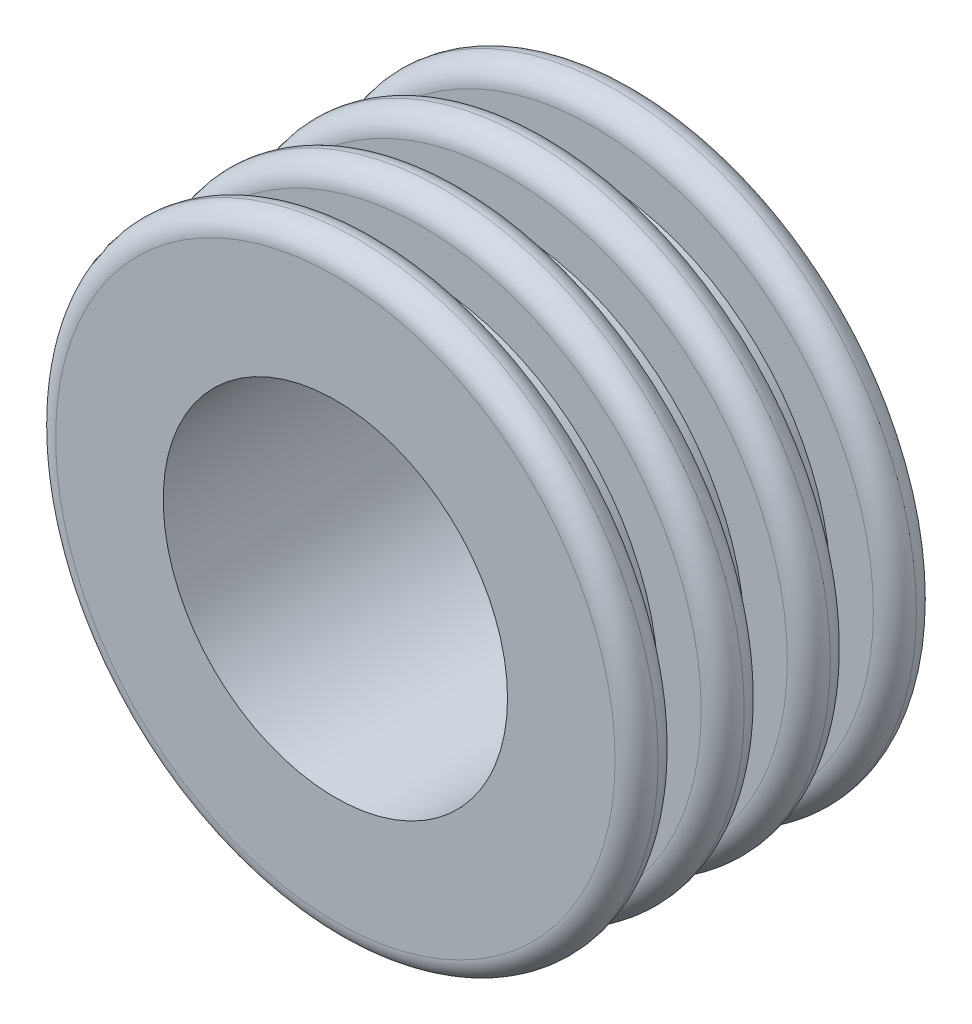
ISO-10303-21;
HEADER;
FILE_DESCRIPTION(('STEP AP214'),'2;1');
FILE_NAME('part.step','',(''),(''),'','','');
FILE_SCHEMA(('AUTOMOTIVE_DESIGN { 1 0 10303 214 1 1 1 1 }'));
ENDSEC;
DATA;
#1=APPLICATION_CONTEXT('core data for automotive mechanical design processes');
#2=APPLICATION_PROTOCOL_DEFINITION('international standard','automotive_design',2000,#1);
#3=PRODUCT_CONTEXT('',#1,'mechanical');
#4=PRODUCT('Part','Part','',(#3));
#5=PRODUCT_RELATED_PRODUCT_CATEGORY('part','',(#4));
#6=PRODUCT_DEFINITION_FORMATION('','',#4);
#7=PRODUCT_DEFINITION_CONTEXT('part definition',#1,'design');
#8=PRODUCT_DEFINITION('design','',#6,#7);
#9=PRODUCT_DEFINITION_SHAPE('','',#8);
#10=(LENGTH_UNIT() NAMED_UNIT(*) SI_UNIT(.MILLI.,.METRE.));
#11=(NAMED_UNIT(*) PLANE_ANGLE_UNIT() SI_UNIT($,.RADIAN.));
#12=(NAMED_UNIT(*) SI_UNIT($,.STERADIAN.) SOLID_ANGLE_UNIT());
#13=UNCERTAINTY_MEASURE_WITH_UNIT(LENGTH_MEASURE(1.E-05),#10,'distance_accuracy_value','');
#14=(GEOMETRIC_REPRESENTATION_CONTEXT(3) GLOBAL_UNCERTAINTY_ASSIGNED_CONTEXT((#13)) GLOBAL_UNIT_ASSIGNED_CONTEXT((#10,
#11,#12)) REPRESENTATION_CONTEXT('',''));
#15=CARTESIAN_POINT('',(0.,0.,0.));
#16=DIRECTION('',(0.,0.,1.));
#17=DIRECTION('',(1.,0.,0.));
#18=AXIS2_PLACEMENT_3D('',#15,#16,#17);
#19=CARTESIAN_POINT('',(0.,0.,-7.));
#20=DIRECTION('',(0.,0.,-1.));
#21=DIRECTION('',(1.,0.,0.));
#22=AXIS2_PLACEMENT_3D('',#19,#20,#21);
#23=PLANE('',#22);
#24=CARTESIAN_POINT('',(0.,0.,-7.));
#25=DIRECTION('',(0.,0.,1.));
#26=DIRECTION('',(1.,0.,0.));
#27=AXIS2_PLACEMENT_3D('',#24,#25,#26);
#28=CIRCLE('',#27,6.5);
#29=CARTESIAN_POINT('',(6.5,0.,-7.));
#30=VERTEX_POINT('',#29);
#31=EDGE_CURVE('E10',#30,#30,#28,.T.);
#32=ORIENTED_EDGE('',*,*,#31,.F.);
#33=EDGE_LOOP('',(#32));
#34=FACE_BOUND('',#33,.T.);
#35=CARTESIAN_POINT('',(0.,0.,-7.));
#36=DIRECTION('',(0.,0.,1.));
#37=DIRECTION('',(1.,0.,0.));
#38=AXIS2_PLACEMENT_3D('',#35,#36,#37);
#39=CIRCLE('',#38,4.);
#40=CARTESIAN_POINT('',(4.,0.,-7.));
#41=VERTEX_POINT('',#40);
#42=EDGE_CURVE('E88',#41,#41,#39,.T.);
#43=ORIENTED_EDGE('',*,*,#42,.T.);
#44=EDGE_LOOP('',(#43));
#45=FACE_BOUND('',#44,.T.);
#46=ADVANCED_FACE('F35',(#34,#45),#23,.T.);
#47=CARTESIAN_POINT('',(0.,0.,0.));
#48=DIRECTION('',(0.,0.,-1.));
#49=DIRECTION('',(1.,0.,0.));
#50=AXIS2_PLACEMENT_3D('',#47,#48,#49);
#51=PLANE('',#50);
#52=CARTESIAN_POINT('',(0.,0.,0.));
#53=DIRECTION('',(0.,0.,1.));
#54=DIRECTION('',(1.,0.,0.));
#55=AXIS2_PLACEMENT_3D('',#52,#53,#54);
#56=CIRCLE('',#55,6.5);
#57=CARTESIAN_POINT('',(6.5,0.,0.));
#58=VERTEX_POINT('',#57);
#59=EDGE_CURVE('E43',#58,#58,#56,.F.);
#60=ORIENTED_EDGE('',*,*,#59,.F.);
#61=EDGE_LOOP('',(#60));
#62=FACE_BOUND('',#61,.T.);
#63=CARTESIAN_POINT('',(0.,0.,0.));
#64=DIRECTION('',(0.,0.,1.));
#65=DIRECTION('',(1.,0.,0.));
#66=AXIS2_PLACEMENT_3D('',#63,#64,#65);
#67=CIRCLE('',#66,4.);
#68=CARTESIAN_POINT('',(4.,0.,0.));
#69=VERTEX_POINT('',#68);
#70=EDGE_CURVE('E89',#69,#69,#67,.T.);
#71=ORIENTED_EDGE('',*,*,#70,.F.);
#72=EDGE_LOOP('',(#71));
#73=FACE_BOUND('',#72,.T.);
#74=ADVANCED_FACE('F131',(#62,#73),#51,.F.);
#75=CARTESIAN_POINT('',(0.,0.,-7.));
#76=DIRECTION('',(0.,0.,1.));
#77=DIRECTION('',(-1.,0.,0.));
#78=AXIS2_PLACEMENT_3D('',#75,#76,#77);
#79=CYLINDRICAL_SURFACE('',#78,4.);
#80=ORIENTED_EDGE('',*,*,#42,.F.);
#81=EDGE_LOOP('',(#80));
#82=FACE_BOUND('',#81,.T.);
#83=ORIENTED_EDGE('',*,*,#70,.T.);
#84=EDGE_LOOP('',(#83));
#85=FACE_BOUND('',#84,.T.);
#86=ADVANCED_FACE('F137',(#82,#85),#79,.F.);
#87=CARTESIAN_POINT('',(0.,7.,-6.));
#88=DIRECTION('',(0.,0.,-1.));
#89=DIRECTION('',(1.,0.,0.));
#90=AXIS2_PLACEMENT_3D('',#87,#88,#89);
#91=PLANE('',#90);
#92=CARTESIAN_POINT('',(0.,0.,-6.));
#93=DIRECTION('',(0.,0.,1.));
#94=DIRECTION('',(1.,0.,0.));
#95=AXIS2_PLACEMENT_3D('',#92,#93,#94);
#96=CIRCLE('',#95,6.5);
#97=CARTESIAN_POINT('',(6.5,0.,-6.));
#98=VERTEX_POINT('',#97);
#99=EDGE_CURVE('E71',#98,#98,#96,.F.);
#100=ORIENTED_EDGE('',*,*,#99,.F.);
#101=EDGE_LOOP('',(#100));
#102=FACE_BOUND('',#101,.T.);
#103=CARTESIAN_POINT('',(0.,0.,-6.));
#104=DIRECTION('',(0.,0.,-1.));
#105=DIRECTION('',(-1.,0.,0.));
#106=AXIS2_PLACEMENT_3D('',#103,#104,#105);
#107=CIRCLE('',#106,5.5);
#108=CARTESIAN_POINT('',(-5.5,0.,-6.));
#109=VERTEX_POINT('',#108);
#110=EDGE_CURVE('E92',#109,#109,#107,.T.);
#111=ORIENTED_EDGE('',*,*,#110,.T.);
#112=EDGE_LOOP('',(#111));
#113=FACE_BOUND('',#112,.T.);
#114=ADVANCED_FACE('F169',(#102,#113),#91,.F.);
#115=CARTESIAN_POINT('',(0.,0.,0.));
#116=DIRECTION('',(0.,0.,1.));
#117=DIRECTION('',(-1.,0.,0.));
#118=AXIS2_PLACEMENT_3D('',#115,#116,#117);
#119=CYLINDRICAL_SURFACE('',#118,5.5);
#120=CARTESIAN_POINT('',(0.,0.,-5.));
#121=DIRECTION('',(0.,0.,-1.));
#122=DIRECTION('',(-1.,0.,0.));
#123=AXIS2_PLACEMENT_3D('',#120,#121,#122);
#124=CIRCLE('',#123,5.5);
#125=CARTESIAN_POINT('',(-5.5,0.,-5.));
#126=VERTEX_POINT('',#125);
#127=EDGE_CURVE('E97',#126,#126,#124,.T.);
#128=ORIENTED_EDGE('',*,*,#127,.T.);
#129=EDGE_LOOP('',(#128));
#130=FACE_BOUND('',#129,.T.);
#131=ORIENTED_EDGE('',*,*,#110,.F.);
#132=EDGE_LOOP('',(#131));
#133=FACE_BOUND('',#132,.T.);
#134=ADVANCED_FACE('F174',(#130,#133),#119,.T.);
#135=CARTESIAN_POINT('',(0.,7.,-5.));
#136=DIRECTION('',(0.,0.,1.));
#137=DIRECTION('',(-1.,0.,0.));
#138=AXIS2_PLACEMENT_3D('',#135,#136,#137);
#139=PLANE('',#138);
#140=CARTESIAN_POINT('',(0.,0.,-5.));
#141=DIRECTION('',(0.,0.,-1.));
#142=DIRECTION('',(-1.,0.,0.));
#143=AXIS2_PLACEMENT_3D('',#140,#141,#142);
#144=CIRCLE('',#143,6.5);
#145=CARTESIAN_POINT('',(-6.5,0.,-5.));
#146=VERTEX_POINT('',#145);
#147=EDGE_CURVE('E48',#146,#146,#144,.F.);
#148=ORIENTED_EDGE('',*,*,#147,.F.);
#149=EDGE_LOOP('',(#148));
#150=FACE_BOUND('',#149,.T.);
#151=ORIENTED_EDGE('',*,*,#127,.F.);
#152=EDGE_LOOP('',(#151));
#153=FACE_BOUND('',#152,.T.);
#154=ADVANCED_FACE('F179',(#150,#153),#139,.F.);
#155=CARTESIAN_POINT('',(0.,7.,-4.));
#156=DIRECTION('',(0.,0.,-1.));
#157=DIRECTION('',(1.,0.,0.));
#158=AXIS2_PLACEMENT_3D('',#155,#156,#157);
#159=PLANE('',#158);
#160=CARTESIAN_POINT('',(0.,0.,-4.));
#161=DIRECTION('',(0.,0.,1.));
#162=DIRECTION('',(1.,0.,0.));
#163=AXIS2_PLACEMENT_3D('',#160,#161,#162);
#164=CIRCLE('',#163,6.5);
#165=CARTESIAN_POINT('',(6.5,0.,-4.));
#166=VERTEX_POINT('',#165);
#167=EDGE_CURVE('E85',#166,#166,#164,.F.);
#168=ORIENTED_EDGE('',*,*,#167,.F.);
#169=EDGE_LOOP('',(#168));
#170=FACE_BOUND('',#169,.T.);
#171=CARTESIAN_POINT('',(0.,0.,-4.));
#172=DIRECTION('',(0.,0.,-1.));
#173=DIRECTION('',(-1.,0.,0.));
#174=AXIS2_PLACEMENT_3D('',#171,#172,#173);
#175=CIRCLE('',#174,5.5);
#176=CARTESIAN_POINT('',(-5.5,0.,-4.));
#177=VERTEX_POINT('',#176);
#178=EDGE_CURVE('E101',#177,#177,#175,.T.);
#179=ORIENTED_EDGE('',*,*,#178,.T.);
#180=EDGE_LOOP('',(#179));
#181=FACE_BOUND('',#180,.T.);
#182=ADVANCED_FACE('F186',(#170,#181),#159,.F.);
#183=CARTESIAN_POINT('',(0.,0.,0.));
#184=DIRECTION('',(0.,0.,1.));
#185=DIRECTION('',(-1.,0.,0.));
#186=AXIS2_PLACEMENT_3D('',#183,#184,#185);
#187=CYLINDRICAL_SURFACE('',#186,5.5);
#188=CARTESIAN_POINT('',(0.,0.,-3.));
#189=DIRECTION('',(0.,0.,-1.));
#190=DIRECTION('',(-1.,0.,0.));
#191=AXIS2_PLACEMENT_3D('',#188,#189,#190);
#192=CIRCLE('',#191,5.5);
#193=CARTESIAN_POINT('',(-5.5,0.,-3.));
#194=VERTEX_POINT('',#193);
#195=EDGE_CURVE('E55',#194,#194,#192,.T.);
#196=ORIENTED_EDGE('',*,*,#195,.T.);
#197=EDGE_LOOP('',(#196));
#198=FACE_BOUND('',#197,.T.);
#199=ORIENTED_EDGE('',*,*,#178,.F.);
#200=EDGE_LOOP('',(#199));
#201=FACE_BOUND('',#200,.T.);
#202=ADVANCED_FACE('F190',(#198,#201),#187,.T.);
#203=CARTESIAN_POINT('',(0.,7.,-3.));
#204=DIRECTION('',(0.,0.,1.));
#205=DIRECTION('',(-1.,0.,0.));
#206=AXIS2_PLACEMENT_3D('',#203,#204,#205);
#207=PLANE('',#206);
#208=CARTESIAN_POINT('',(0.,0.,-3.));
#209=DIRECTION('',(0.,0.,-1.));
#210=DIRECTION('',(-1.,0.,0.));
#211=AXIS2_PLACEMENT_3D('',#208,#209,#210);
#212=CIRCLE('',#211,6.5);
#213=CARTESIAN_POINT('',(-6.5,0.,-3.));
#214=VERTEX_POINT('',#213);
#215=EDGE_CURVE('E82',#214,#214,#212,.F.);
#216=ORIENTED_EDGE('',*,*,#215,.F.);
#217=EDGE_LOOP('',(#216));
#218=FACE_BOUND('',#217,.T.);
#219=ORIENTED_EDGE('',*,*,#195,.F.);
#220=EDGE_LOOP('',(#219));
#221=FACE_BOUND('',#220,.T.);
#222=ADVANCED_FACE('F194',(#218,#221),#207,.F.);
#223=CARTESIAN_POINT('',(0.,7.,-2.));
#224=DIRECTION('',(0.,0.,-1.));
#225=DIRECTION('',(1.,0.,0.));
#226=AXIS2_PLACEMENT_3D('',#223,#224,#225);
#227=PLANE('',#226);
#228=CARTESIAN_POINT('',(0.,0.,-2.));
#229=DIRECTION('',(0.,0.,1.));
#230=DIRECTION('',(1.,0.,0.));
#231=AXIS2_PLACEMENT_3D('',#228,#229,#230);
#232=CIRCLE('',#231,6.5);
#233=CARTESIAN_POINT('',(6.5,0.,-2.));
#234=VERTEX_POINT('',#233);
#235=EDGE_CURVE('E73',#234,#234,#232,.F.);
#236=ORIENTED_EDGE('',*,*,#235,.F.);
#237=EDGE_LOOP('',(#236));
#238=FACE_BOUND('',#237,.T.);
#239=CARTESIAN_POINT('',(0.,0.,-2.));
#240=DIRECTION('',(0.,0.,-1.));
#241=DIRECTION('',(-1.,0.,0.));
#242=AXIS2_PLACEMENT_3D('',#239,#240,#241);
#243=CIRCLE('',#242,5.5);
#244=CARTESIAN_POINT('',(-5.5,0.,-2.));
#245=VERTEX_POINT('',#244);
#246=EDGE_CURVE('E100',#245,#245,#243,.T.);
#247=ORIENTED_EDGE('',*,*,#246,.T.);
#248=EDGE_LOOP('',(#247));
#249=FACE_BOUND('',#248,.T.);
#250=ADVANCED_FACE('F127',(#238,#249),#227,.F.);
#251=CARTESIAN_POINT('',(0.,0.,0.));
#252=DIRECTION('',(0.,0.,1.));
#253=DIRECTION('',(-1.,0.,0.));
#254=AXIS2_PLACEMENT_3D('',#251,#252,#253);
#255=CYLINDRICAL_SURFACE('',#254,5.5);
#256=CARTESIAN_POINT('',(0.,0.,-1.));
#257=DIRECTION('',(0.,0.,-1.));
#258=DIRECTION('',(-1.,0.,0.));
#259=AXIS2_PLACEMENT_3D('',#256,#257,#258);
#260=CIRCLE('',#259,5.5);
#261=CARTESIAN_POINT('',(-5.5,0.,-1.));
#262=VERTEX_POINT('',#261);
#263=EDGE_CURVE('E104',#262,#262,#260,.T.);
#264=ORIENTED_EDGE('',*,*,#263,.T.);
#265=EDGE_LOOP('',(#264));
#266=FACE_BOUND('',#265,.T.);
#267=ORIENTED_EDGE('',*,*,#246,.F.);
#268=EDGE_LOOP('',(#267));
#269=FACE_BOUND('',#268,.T.);
#270=ADVANCED_FACE('F112',(#266,#269),#255,.T.);
#271=CARTESIAN_POINT('',(0.,7.,-1.));
#272=DIRECTION('',(0.,0.,1.));
#273=DIRECTION('',(-1.,0.,0.));
#274=AXIS2_PLACEMENT_3D('',#271,#272,#273);
#275=PLANE('',#274);
#276=CARTESIAN_POINT('',(0.,0.,-1.));
#277=DIRECTION('',(0.,0.,-1.));
#278=DIRECTION('',(-1.,0.,0.));
#279=AXIS2_PLACEMENT_3D('',#276,#277,#278);
#280=CIRCLE('',#279,6.5);
#281=CARTESIAN_POINT('',(-6.5,0.,-1.));
#282=VERTEX_POINT('',#281);
#283=EDGE_CURVE('E77',#282,#282,#280,.F.);
#284=ORIENTED_EDGE('',*,*,#283,.F.);
#285=EDGE_LOOP('',(#284));
#286=FACE_BOUND('',#285,.T.);
#287=ORIENTED_EDGE('',*,*,#263,.F.);
#288=EDGE_LOOP('',(#287));
#289=FACE_BOUND('',#288,.T.);
#290=ADVANCED_FACE('F115',(#286,#289),#275,.F.);
#291=CARTESIAN_POINT('',(0.,0.,-4.5));
#292=DIRECTION('',(0.,0.,1.));
#293=DIRECTION('',(-1.,0.,0.));
#294=AXIS2_PLACEMENT_3D('',#291,#292,#293);
#295=TOROIDAL_SURFACE('',#294,6.5,0.5);
#296=ORIENTED_EDGE('',*,*,#147,.T.);
#297=EDGE_LOOP('',(#296));
#298=FACE_BOUND('',#297,.T.);
#299=CARTESIAN_POINT('',(0.,0.,-4.5));
#300=DIRECTION('',(0.,0.,-1.));
#301=DIRECTION('',(-1.,0.,0.));
#302=AXIS2_PLACEMENT_3D('',#299,#300,#301);
#303=CIRCLE('',#302,7.);
#304=CARTESIAN_POINT('',(-7.,0.,-4.5));
#305=VERTEX_POINT('',#304);
#306=EDGE_CURVE('E52',#305,#305,#303,.T.);
#307=ORIENTED_EDGE('',*,*,#306,.T.);
#308=EDGE_LOOP('',(#307));
#309=FACE_BOUND('',#308,.T.);
#310=ADVANCED_FACE('F117',(#298,#309),#295,.T.);
#311=CARTESIAN_POINT('',(0.,0.,-4.5));
#312=DIRECTION('',(0.,0.,-1.));
#313=DIRECTION('',(1.,0.,0.));
#314=AXIS2_PLACEMENT_3D('',#311,#312,#313);
#315=TOROIDAL_SURFACE('',#314,6.5,0.5);
#316=ORIENTED_EDGE('',*,*,#306,.F.);
#317=EDGE_LOOP('',(#316));
#318=FACE_BOUND('',#317,.T.);
#319=ORIENTED_EDGE('',*,*,#167,.T.);
#320=EDGE_LOOP('',(#319));
#321=FACE_BOUND('',#320,.T.);
#322=ADVANCED_FACE('F124',(#318,#321),#315,.T.);
#323=CARTESIAN_POINT('',(0.,0.,-2.5));
#324=DIRECTION('',(0.,0.,-1.));
#325=DIRECTION('',(1.,0.,0.));
#326=AXIS2_PLACEMENT_3D('',#323,#324,#325);
#327=TOROIDAL_SURFACE('',#326,6.5,0.5);
#328=ORIENTED_EDGE('',*,*,#235,.T.);
#329=EDGE_LOOP('',(#328));
#330=FACE_BOUND('',#329,.T.);
#331=CARTESIAN_POINT('',(0.,0.,-2.5));
#332=DIRECTION('',(0.,0.,1.));
#333=DIRECTION('',(1.,0.,0.));
#334=AXIS2_PLACEMENT_3D('',#331,#332,#333);
#335=CIRCLE('',#334,7.);
#336=CARTESIAN_POINT('',(7.,0.,-2.5));
#337=VERTEX_POINT('',#336);
#338=EDGE_CURVE('E56',#337,#337,#335,.T.);
#339=ORIENTED_EDGE('',*,*,#338,.T.);
#340=EDGE_LOOP('',(#339));
#341=FACE_BOUND('',#340,.T.);
#342=ADVANCED_FACE('F145',(#330,#341),#327,.T.);
#343=CARTESIAN_POINT('',(0.,0.,-2.5));
#344=DIRECTION('',(0.,0.,1.));
#345=DIRECTION('',(-1.,0.,0.));
#346=AXIS2_PLACEMENT_3D('',#343,#344,#345);
#347=TOROIDAL_SURFACE('',#346,6.5,0.5);
#348=ORIENTED_EDGE('',*,*,#215,.T.);
#349=EDGE_LOOP('',(#348));
#350=FACE_BOUND('',#349,.T.);
#351=ORIENTED_EDGE('',*,*,#338,.F.);
#352=EDGE_LOOP('',(#351));
#353=FACE_BOUND('',#352,.T.);
#354=ADVANCED_FACE('F148',(#350,#353),#347,.T.);
#355=CARTESIAN_POINT('',(0.,0.,-0.5));
#356=DIRECTION('',(0.,0.,-1.));
#357=DIRECTION('',(1.,0.,0.));
#358=AXIS2_PLACEMENT_3D('',#355,#356,#357);
#359=TOROIDAL_SURFACE('',#358,6.5,0.5);
#360=ORIENTED_EDGE('',*,*,#59,.T.);
#361=EDGE_LOOP('',(#360));
#362=FACE_BOUND('',#361,.T.);
#363=CARTESIAN_POINT('',(0.,0.,-0.5));
#364=DIRECTION('',(0.,0.,1.));
#365=DIRECTION('',(1.,0.,0.));
#366=AXIS2_PLACEMENT_3D('',#363,#364,#365);
#367=CIRCLE('',#366,7.);
#368=CARTESIAN_POINT('',(7.,0.,-0.5));
#369=VERTEX_POINT('',#368);
#370=EDGE_CURVE('E58',#369,#369,#367,.T.);
#371=ORIENTED_EDGE('',*,*,#370,.T.);
#372=EDGE_LOOP('',(#371));
#373=FACE_BOUND('',#372,.T.);
#374=ADVANCED_FACE('F151',(#362,#373),#359,.T.);
#375=CARTESIAN_POINT('',(0.,0.,-0.5));
#376=DIRECTION('',(0.,0.,1.));
#377=DIRECTION('',(-1.,0.,0.));
#378=AXIS2_PLACEMENT_3D('',#375,#376,#377);
#379=TOROIDAL_SURFACE('',#378,6.5,0.5);
#380=ORIENTED_EDGE('',*,*,#283,.T.);
#381=EDGE_LOOP('',(#380));
#382=FACE_BOUND('',#381,.T.);
#383=ORIENTED_EDGE('',*,*,#370,.F.);
#384=EDGE_LOOP('',(#383));
#385=FACE_BOUND('',#384,.T.);
#386=ADVANCED_FACE('F156',(#382,#385),#379,.T.);
#387=CARTESIAN_POINT('',(0.,0.,-6.5));
#388=DIRECTION('',(0.,0.,-1.));
#389=DIRECTION('',(1.,0.,0.));
#390=AXIS2_PLACEMENT_3D('',#387,#388,#389);
#391=TOROIDAL_SURFACE('',#390,6.5,0.5);
#392=ORIENTED_EDGE('',*,*,#31,.T.);
#393=EDGE_LOOP('',(#392));
#394=FACE_BOUND('',#393,.T.);
#395=CARTESIAN_POINT('',(0.,0.,-6.5));
#396=DIRECTION('',(0.,0.,1.));
#397=DIRECTION('',(1.,0.,0.));
#398=AXIS2_PLACEMENT_3D('',#395,#396,#397);
#399=CIRCLE('',#398,7.);
#400=CARTESIAN_POINT('',(7.,0.,-6.5));
#401=VERTEX_POINT('',#400);
#402=EDGE_CURVE('E39',#401,#401,#399,.F.);
#403=ORIENTED_EDGE('',*,*,#402,.T.);
#404=EDGE_LOOP('',(#403));
#405=FACE_BOUND('',#404,.T.);
#406=ADVANCED_FACE('F37',(#394,#405),#391,.T.);
#407=CARTESIAN_POINT('',(0.,0.,-6.5));
#408=DIRECTION('',(0.,0.,-1.));
#409=DIRECTION('',(1.,0.,0.));
#410=AXIS2_PLACEMENT_3D('',#407,#408,#409);
#411=TOROIDAL_SURFACE('',#410,6.5,0.5);
#412=ORIENTED_EDGE('',*,*,#402,.F.);
#413=EDGE_LOOP('',(#412));
#414=FACE_BOUND('',#413,.T.);
#415=ORIENTED_EDGE('',*,*,#99,.T.);
#416=EDGE_LOOP('',(#415));
#417=FACE_BOUND('',#416,.T.);
#418=ADVANCED_FACE('F66',(#414,#417),#411,.T.);
#419=CLOSED_SHELL('',(#46,#74,#86,#114,#134,#154,#182,#202,#222,#250,#270,#290,#310,#322,#342,
#354,#374,#386,#406,#418));
#420=MANIFOLD_SOLID_BREP('B2',#419);
#421=ADVANCED_BREP_SHAPE_REPRESENTATION('',(#18,#420),#14);
#422=SHAPE_DEFINITION_REPRESENTATION(#9,#421);
ENDSEC;
END-ISO-10303-21;
